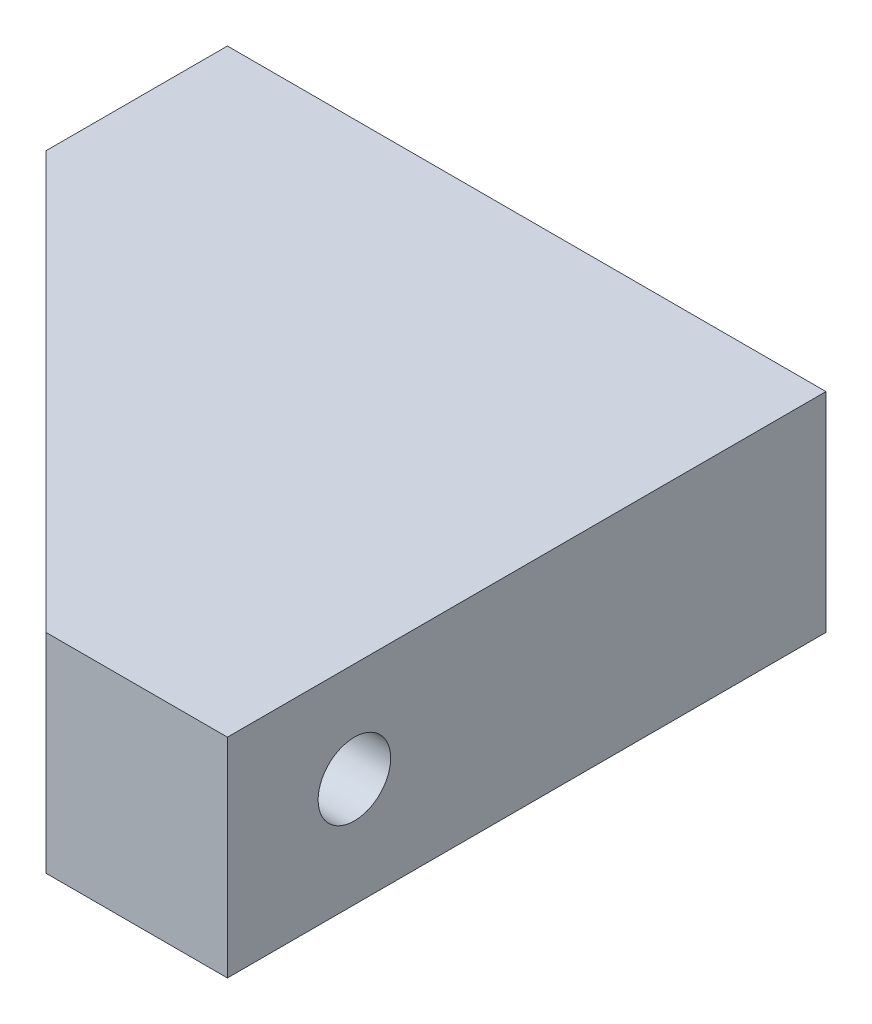
ISO-10303-21;
HEADER;
FILE_DESCRIPTION(('STEP AP214'),'2;1');
FILE_NAME('part.step','',(''),(''),'','','');
FILE_SCHEMA(('AUTOMOTIVE_DESIGN { 1 0 10303 214 1 1 1 1 }'));
ENDSEC;
DATA;
#1=APPLICATION_CONTEXT('core data for automotive mechanical design processes');
#2=APPLICATION_PROTOCOL_DEFINITION('international standard','automotive_design',2000,#1);
#3=PRODUCT_CONTEXT('',#1,'mechanical');
#4=PRODUCT('Part','Part','',(#3));
#5=PRODUCT_RELATED_PRODUCT_CATEGORY('part','',(#4));
#6=PRODUCT_DEFINITION_FORMATION('','',#4);
#7=PRODUCT_DEFINITION_CONTEXT('part definition',#1,'design');
#8=PRODUCT_DEFINITION('design','',#6,#7);
#9=PRODUCT_DEFINITION_SHAPE('','',#8);
#10=(LENGTH_UNIT() NAMED_UNIT(*) SI_UNIT(.MILLI.,.METRE.));
#11=(NAMED_UNIT(*) PLANE_ANGLE_UNIT() SI_UNIT($,.RADIAN.));
#12=(NAMED_UNIT(*) SI_UNIT($,.STERADIAN.) SOLID_ANGLE_UNIT());
#13=UNCERTAINTY_MEASURE_WITH_UNIT(LENGTH_MEASURE(1.E-05),#10,'distance_accuracy_value','');
#14=(GEOMETRIC_REPRESENTATION_CONTEXT(3) GLOBAL_UNCERTAINTY_ASSIGNED_CONTEXT((#13)) GLOBAL_UNIT_ASSIGNED_CONTEXT((#10,
#11,#12)) REPRESENTATION_CONTEXT('',''));
#15=CARTESIAN_POINT('',(0.,0.,0.));
#16=DIRECTION('',(0.,0.,1.));
#17=DIRECTION('',(1.,0.,0.));
#18=AXIS2_PLACEMENT_3D('',#15,#16,#17);
#19=CARTESIAN_POINT('',(-31.9393939393939,9.20833333333334,10.));
#20=DIRECTION('',(1.,0.,0.));
#21=DIRECTION('',(0.,0.,-1.));
#22=AXIS2_PLACEMENT_3D('',#19,#20,#21);
#23=PLANE('',#22);
#24=DIRECTION('',(0.,-1.,0.));
#25=VECTOR('',#24,1.);
#26=CARTESIAN_POINT('',(-31.9393939393939,9.20833333333334,10.));
#27=LINE('',#26,#25);
#28=CARTESIAN_POINT('',(-31.9393939393939,-2.29166666666666,10.));
#29=VERTEX_POINT('',#28);
#30=CARTESIAN_POINT('',(-31.9393939393939,-13.7916666666667,10.));
#31=VERTEX_POINT('',#30);
#32=EDGE_CURVE('E93',#29,#31,#27,.T.);
#33=ORIENTED_EDGE('',*,*,#32,.F.);
#34=DIRECTION('',(0.,0.,1.));
#35=VECTOR('',#34,1.);
#36=CARTESIAN_POINT('',(-31.9393939393939,-2.29166666666666,0.));
#37=LINE('',#36,#35);
#38=CARTESIAN_POINT('',(-31.9393939393939,-2.29166666666666,0.));
#39=VERTEX_POINT('',#38);
#40=EDGE_CURVE('E48',#39,#29,#37,.T.);
#41=ORIENTED_EDGE('',*,*,#40,.F.);
#42=DIRECTION('',(0.,-1.,0.));
#43=VECTOR('',#42,1.);
#44=CARTESIAN_POINT('',(-31.9393939393939,9.20833333333334,0.));
#45=LINE('',#44,#43);
#46=CARTESIAN_POINT('',(-31.9393939393939,-13.7916666666667,0.));
#47=VERTEX_POINT('',#46);
#48=EDGE_CURVE('E92',#39,#47,#45,.T.);
#49=ORIENTED_EDGE('',*,*,#48,.T.);
#50=DIRECTION('',(0.,0.,-1.));
#51=VECTOR('',#50,1.);
#52=CARTESIAN_POINT('',(-31.9393939393939,-13.7916666666667,10.));
#53=LINE('',#52,#51);
#54=EDGE_CURVE('E42',#31,#47,#53,.T.);
#55=ORIENTED_EDGE('',*,*,#54,.F.);
#56=EDGE_LOOP('',(#33,#41,#49,#55));
#57=FACE_BOUND('',#56,.T.);
#58=ADVANCED_FACE('F35',(#57),#23,.F.);
#59=CARTESIAN_POINT('',(-31.9393939393939,-13.7916666666667,10.));
#60=DIRECTION('',(0.,1.,0.));
#61=DIRECTION('',(0.,0.,1.));
#62=AXIS2_PLACEMENT_3D('',#59,#60,#61);
#63=PLANE('',#62);
#64=DIRECTION('',(1.,0.,0.));
#65=VECTOR('',#64,1.);
#66=CARTESIAN_POINT('',(-31.9393939393939,-13.7916666666667,0.));
#67=LINE('',#66,#65);
#68=CARTESIAN_POINT('',(1.06060606060608,-13.7916666666667,0.));
#69=VERTEX_POINT('',#68);
#70=EDGE_CURVE('E56',#47,#69,#67,.T.);
#71=ORIENTED_EDGE('',*,*,#70,.T.);
#72=DIRECTION('',(0.,0.,-1.));
#73=VECTOR('',#72,1.);
#74=CARTESIAN_POINT('',(1.06060606060608,-13.7916666666667,10.));
#75=LINE('',#74,#73);
#76=CARTESIAN_POINT('',(1.06060606060608,-13.7916666666667,33.));
#77=VERTEX_POINT('',#76);
#78=EDGE_CURVE('E106',#77,#69,#75,.T.);
#79=ORIENTED_EDGE('',*,*,#78,.F.);
#80=DIRECTION('',(1.,0.,0.));
#81=VECTOR('',#80,1.);
#82=CARTESIAN_POINT('',(1.06060606060608,-13.7916666666667,33.));
#83=LINE('',#82,#81);
#84=CARTESIAN_POINT('',(-8.93939393939391,-13.7916666666667,33.));
#85=VERTEX_POINT('',#84);
#86=EDGE_CURVE('E96',#85,#77,#83,.T.);
#87=ORIENTED_EDGE('',*,*,#86,.F.);
#88=DIRECTION('',(-0.707106781186548,0.,-0.707106781186547));
#89=VECTOR('',#88,1.);
#90=CARTESIAN_POINT('',(-8.93939393939391,-13.7916666666667,33.));
#91=LINE('',#90,#89);
#92=EDGE_CURVE('E134',#85,#31,#91,.T.);
#93=ORIENTED_EDGE('',*,*,#92,.T.);
#94=ORIENTED_EDGE('',*,*,#54,.T.);
#95=EDGE_LOOP('',(#71,#79,#87,#93,#94));
#96=FACE_BOUND('',#95,.T.);
#97=ADVANCED_FACE('F153',(#96),#63,.F.);
#98=CARTESIAN_POINT('',(1.06060606060608,9.20833333333334,10.));
#99=DIRECTION('',(-1.,0.,0.));
#100=DIRECTION('',(0.,0.,1.));
#101=AXIS2_PLACEMENT_3D('',#98,#99,#100);
#102=PLANE('',#101);
#103=CARTESIAN_POINT('',(1.06060606060608,-7.79166666666666,26.));
#104=DIRECTION('',(-1.,0.,0.));
#105=DIRECTION('',(0.,0.,1.));
#106=AXIS2_PLACEMENT_3D('',#103,#104,#105);
#107=CIRCLE('',#106,2.);
#108=CARTESIAN_POINT('',(1.06060606060608,-7.79166666666666,28.));
#109=VERTEX_POINT('',#108);
#110=EDGE_CURVE('E113',#109,#109,#107,.T.);
#111=ORIENTED_EDGE('',*,*,#110,.T.);
#112=EDGE_LOOP('',(#111));
#113=FACE_BOUND('',#112,.T.);
#114=DIRECTION('',(0.,1.,0.));
#115=VECTOR('',#114,1.);
#116=CARTESIAN_POINT('',(1.06060606060608,9.20833333333334,0.));
#117=LINE('',#116,#115);
#118=CARTESIAN_POINT('',(1.06060606060608,-2.29166666666666,0.));
#119=VERTEX_POINT('',#118);
#120=EDGE_CURVE('E98',#69,#119,#117,.T.);
#121=ORIENTED_EDGE('',*,*,#120,.T.);
#122=DIRECTION('',(0.,0.,1.));
#123=VECTOR('',#122,1.);
#124=CARTESIAN_POINT('',(1.06060606060608,-2.29166666666666,10.));
#125=LINE('',#124,#123);
#126=CARTESIAN_POINT('',(1.06060606060608,-2.29166666666666,33.));
#127=VERTEX_POINT('',#126);
#128=EDGE_CURVE('E82',#119,#127,#125,.T.);
#129=ORIENTED_EDGE('',*,*,#128,.T.);
#130=DIRECTION('',(0.,1.,0.));
#131=VECTOR('',#130,1.);
#132=CARTESIAN_POINT('',(1.06060606060608,9.20833333333334,33.));
#133=LINE('',#132,#131);
#134=EDGE_CURVE('E112',#77,#127,#133,.T.);
#135=ORIENTED_EDGE('',*,*,#134,.F.);
#136=ORIENTED_EDGE('',*,*,#78,.T.);
#137=EDGE_LOOP('',(#121,#129,#135,#136));
#138=FACE_BOUND('',#137,.T.);
#139=ADVANCED_FACE('F155',(#113,#138),#102,.F.);
#140=CARTESIAN_POINT('',(0.,0.,0.));
#141=DIRECTION('',(0.,0.,1.));
#142=DIRECTION('',(1.,0.,0.));
#143=AXIS2_PLACEMENT_3D('',#140,#141,#142);
#144=PLANE('',#143);
#145=CARTESIAN_POINT('',(-24.9393939393939,-7.79166666666666,0.));
#146=DIRECTION('',(0.,0.,1.));
#147=DIRECTION('',(1.,0.,0.));
#148=AXIS2_PLACEMENT_3D('',#145,#146,#147);
#149=CIRCLE('',#148,2.);
#150=CARTESIAN_POINT('',(-22.9393939393939,-7.79166666666666,0.));
#151=VERTEX_POINT('',#150);
#152=EDGE_CURVE('E109',#151,#151,#149,.T.);
#153=ORIENTED_EDGE('',*,*,#152,.T.);
#154=EDGE_LOOP('',(#153));
#155=FACE_BOUND('',#154,.T.);
#156=ORIENTED_EDGE('',*,*,#48,.F.);
#157=DIRECTION('',(-1.,0.,0.));
#158=VECTOR('',#157,1.);
#159=CARTESIAN_POINT('',(21.0606060606061,-2.29166666666666,0.));
#160=LINE('',#159,#158);
#161=EDGE_CURVE('E79',#119,#39,#160,.T.);
#162=ORIENTED_EDGE('',*,*,#161,.F.);
#163=ORIENTED_EDGE('',*,*,#120,.F.);
#164=ORIENTED_EDGE('',*,*,#70,.F.);
#165=EDGE_LOOP('',(#156,#162,#163,#164));
#166=FACE_BOUND('',#165,.T.);
#167=ADVANCED_FACE('F95',(#155,#166),#144,.F.);
#168=CARTESIAN_POINT('',(0.,0.,33.));
#169=DIRECTION('',(0.,0.,-1.));
#170=DIRECTION('',(-1.,0.,0.));
#171=AXIS2_PLACEMENT_3D('',#168,#169,#170);
#172=PLANE('',#171);
#173=ORIENTED_EDGE('',*,*,#134,.T.);
#174=DIRECTION('',(-1.,0.,0.));
#175=VECTOR('',#174,1.);
#176=CARTESIAN_POINT('',(21.0606060606061,-2.29166666666666,33.));
#177=LINE('',#176,#175);
#178=CARTESIAN_POINT('',(-8.93939393939392,-2.29166666666666,33.));
#179=VERTEX_POINT('',#178);
#180=EDGE_CURVE('E87',#127,#179,#177,.T.);
#181=ORIENTED_EDGE('',*,*,#180,.T.);
#182=DIRECTION('',(0.,-1.,0.));
#183=VECTOR('',#182,1.);
#184=CARTESIAN_POINT('',(-8.93939393939392,9.20833333333334,33.));
#185=LINE('',#184,#183);
#186=EDGE_CURVE('E101',#179,#85,#185,.T.);
#187=ORIENTED_EDGE('',*,*,#186,.T.);
#188=ORIENTED_EDGE('',*,*,#86,.T.);
#189=EDGE_LOOP('',(#173,#181,#187,#188));
#190=FACE_BOUND('',#189,.T.);
#191=ADVANCED_FACE('F147',(#190),#172,.F.);
#192=CARTESIAN_POINT('',(-24.9393939393939,-7.79166666666666,-23.));
#193=DIRECTION('',(0.,0.,1.));
#194=DIRECTION('',(1.,0.,0.));
#195=AXIS2_PLACEMENT_3D('',#192,#193,#194);
#196=CYLINDRICAL_SURFACE('',#195,2.);
#197=CARTESIAN_POINT('',(-24.9393939393939,-7.79166666666666,10.));
#198=DIRECTION('',(0.,0.,-1.));
#199=DIRECTION('',(-1.,0.,0.));
#200=AXIS2_PLACEMENT_3D('',#197,#198,#199);
#201=CIRCLE('',#200,2.);
#202=CARTESIAN_POINT('',(-26.9393939393939,-7.79166666666666,10.));
#203=VERTEX_POINT('',#202);
#204=EDGE_CURVE('E120',#203,#203,#201,.F.);
#205=ORIENTED_EDGE('',*,*,#204,.T.);
#206=EDGE_LOOP('',(#205));
#207=FACE_BOUND('',#206,.T.);
#208=ORIENTED_EDGE('',*,*,#152,.F.);
#209=EDGE_LOOP('',(#208));
#210=FACE_BOUND('',#209,.T.);
#211=ADVANCED_FACE('F226',(#207,#210),#196,.F.);
#212=CARTESIAN_POINT('',(24.0606060606061,-7.79166666666666,26.));
#213=DIRECTION('',(-1.,0.,0.));
#214=DIRECTION('',(0.,-1.,0.));
#215=AXIS2_PLACEMENT_3D('',#212,#213,#214);
#216=CYLINDRICAL_SURFACE('',#215,2.);
#217=CARTESIAN_POINT('',(-8.93939393939391,-7.79166666666666,26.));
#218=DIRECTION('',(1.,0.,0.));
#219=DIRECTION('',(0.,0.,-1.));
#220=AXIS2_PLACEMENT_3D('',#217,#218,#219);
#221=CIRCLE('',#220,2.);
#222=CARTESIAN_POINT('',(-8.93939393939391,-7.79166666666666,24.));
#223=VERTEX_POINT('',#222);
#224=EDGE_CURVE('E116',#223,#223,#221,.F.);
#225=ORIENTED_EDGE('',*,*,#224,.T.);
#226=EDGE_LOOP('',(#225));
#227=FACE_BOUND('',#226,.T.);
#228=ORIENTED_EDGE('',*,*,#110,.F.);
#229=EDGE_LOOP('',(#228));
#230=FACE_BOUND('',#229,.T.);
#231=ADVANCED_FACE('F222',(#227,#230),#216,.F.);
#232=CARTESIAN_POINT('',(-8.93939393939391,9.20833333333334,33.));
#233=DIRECTION('',(-0.707106781186547,0.,0.707106781186548));
#234=DIRECTION('',(0.707106781186548,0.,0.707106781186547));
#235=AXIS2_PLACEMENT_3D('',#232,#233,#234);
#236=PLANE('',#235);
#237=DIRECTION('',(0.707106781186548,0.,0.707106781186547));
#238=VECTOR('',#237,1.);
#239=CARTESIAN_POINT('',(-8.93939393939391,-2.29166666666666,33.));
#240=LINE('',#239,#238);
#241=EDGE_CURVE('E11',#29,#179,#240,.T.);
#242=ORIENTED_EDGE('',*,*,#241,.F.);
#243=ORIENTED_EDGE('',*,*,#32,.T.);
#244=ORIENTED_EDGE('',*,*,#92,.F.);
#245=ORIENTED_EDGE('',*,*,#186,.F.);
#246=EDGE_LOOP('',(#242,#243,#244,#245));
#247=FACE_BOUND('',#246,.T.);
#248=CARTESIAN_POINT('',(-24.9393939393939,-7.79166666666666,17.));
#249=DIRECTION('',(-0.707106781186547,0.,0.707106781186548));
#250=DIRECTION('',(-0.707106781186548,0.,-0.707106781186547));
#251=AXIS2_PLACEMENT_3D('',#248,#249,#250);
#252=ELLIPSE('',#251,4.94974746830583,3.5);
#253=CARTESIAN_POINT('',(-28.4393939393939,-7.79166666666666,13.5));
#254=VERTEX_POINT('',#253);
#255=EDGE_CURVE('E118',#254,#254,#252,.T.);
#256=ORIENTED_EDGE('',*,*,#255,.F.);
#257=EDGE_LOOP('',(#256));
#258=FACE_BOUND('',#257,.T.);
#259=CARTESIAN_POINT('',(-15.9393939393939,-7.79166666666666,26.));
#260=DIRECTION('',(-0.707106781186547,0.,0.707106781186548));
#261=DIRECTION('',(0.707106781186548,0.,0.707106781186547));
#262=AXIS2_PLACEMENT_3D('',#259,#260,#261);
#263=ELLIPSE('',#262,4.94974746830583,3.5);
#264=CARTESIAN_POINT('',(-12.4393939393939,-7.79166666666666,29.5));
#265=VERTEX_POINT('',#264);
#266=EDGE_CURVE('E114',#265,#265,#263,.T.);
#267=ORIENTED_EDGE('',*,*,#266,.F.);
#268=EDGE_LOOP('',(#267));
#269=FACE_BOUND('',#268,.T.);
#270=ADVANCED_FACE('F151',(#247,#258,#269),#236,.T.);
#271=CARTESIAN_POINT('',(-8.93939393939391,-7.79166666666666,26.));
#272=DIRECTION('',(1.,0.,0.));
#273=DIRECTION('',(0.,0.,-1.));
#274=AXIS2_PLACEMENT_3D('',#271,#272,#273);
#275=PLANE('',#274);
#276=CARTESIAN_POINT('',(-8.93939393939391,-7.79166666666666,26.));
#277=DIRECTION('',(1.,0.,0.));
#278=DIRECTION('',(0.,0.,-1.));
#279=AXIS2_PLACEMENT_3D('',#276,#277,#278);
#280=CIRCLE('',#279,3.5);
#281=CARTESIAN_POINT('',(-8.93939393939391,-7.79166666666666,22.5));
#282=VERTEX_POINT('',#281);
#283=EDGE_CURVE('E117',#282,#282,#280,.T.);
#284=ORIENTED_EDGE('',*,*,#283,.F.);
#285=EDGE_LOOP('',(#284));
#286=FACE_BOUND('',#285,.T.);
#287=ORIENTED_EDGE('',*,*,#224,.F.);
#288=EDGE_LOOP('',(#287));
#289=FACE_BOUND('',#288,.T.);
#290=ADVANCED_FACE('F197',(#286,#289),#275,.F.);
#291=CARTESIAN_POINT('',(-41.9393939393939,-7.79166666666666,26.));
#292=DIRECTION('',(1.,0.,0.));
#293=DIRECTION('',(0.,0.,-1.));
#294=AXIS2_PLACEMENT_3D('',#291,#292,#293);
#295=CYLINDRICAL_SURFACE('',#294,3.5);
#296=ORIENTED_EDGE('',*,*,#266,.T.);
#297=EDGE_LOOP('',(#296));
#298=FACE_BOUND('',#297,.T.);
#299=ORIENTED_EDGE('',*,*,#283,.T.);
#300=EDGE_LOOP('',(#299));
#301=FACE_BOUND('',#300,.T.);
#302=ADVANCED_FACE('F187',(#298,#301),#295,.F.);
#303=CARTESIAN_POINT('',(-24.9393939393939,-7.79166666666666,10.));
#304=DIRECTION('',(0.,0.,-1.));
#305=DIRECTION('',(-1.,0.,0.));
#306=AXIS2_PLACEMENT_3D('',#303,#304,#305);
#307=PLANE('',#306);
#308=CARTESIAN_POINT('',(-24.9393939393939,-7.79166666666666,10.));
#309=DIRECTION('',(0.,0.,-1.));
#310=DIRECTION('',(-1.,0.,0.));
#311=AXIS2_PLACEMENT_3D('',#308,#309,#310);
#312=CIRCLE('',#311,3.5);
#313=CARTESIAN_POINT('',(-28.4393939393939,-7.79166666666666,10.));
#314=VERTEX_POINT('',#313);
#315=EDGE_CURVE('E121',#314,#314,#312,.T.);
#316=ORIENTED_EDGE('',*,*,#315,.F.);
#317=EDGE_LOOP('',(#316));
#318=FACE_BOUND('',#317,.T.);
#319=ORIENTED_EDGE('',*,*,#204,.F.);
#320=EDGE_LOOP('',(#319));
#321=FACE_BOUND('',#320,.T.);
#322=ADVANCED_FACE('F176',(#318,#321),#307,.F.);
#323=CARTESIAN_POINT('',(-24.9393939393939,-7.79166666666666,43.));
#324=DIRECTION('',(0.,0.,-1.));
#325=DIRECTION('',(-1.,0.,0.));
#326=AXIS2_PLACEMENT_3D('',#323,#324,#325);
#327=CYLINDRICAL_SURFACE('',#326,3.5);
#328=ORIENTED_EDGE('',*,*,#255,.T.);
#329=EDGE_LOOP('',(#328));
#330=FACE_BOUND('',#329,.T.);
#331=ORIENTED_EDGE('',*,*,#315,.T.);
#332=EDGE_LOOP('',(#331));
#333=FACE_BOUND('',#332,.T.);
#334=ADVANCED_FACE('F171',(#330,#333),#327,.F.);
#335=CARTESIAN_POINT('',(21.0606060606061,-2.29166666666666,0.));
#336=DIRECTION('',(0.,-1.,0.));
#337=DIRECTION('',(0.,0.,-1.));
#338=AXIS2_PLACEMENT_3D('',#335,#336,#337);
#339=PLANE('',#338);
#340=ORIENTED_EDGE('',*,*,#161,.T.);
#341=ORIENTED_EDGE('',*,*,#40,.T.);
#342=ORIENTED_EDGE('',*,*,#241,.T.);
#343=ORIENTED_EDGE('',*,*,#180,.F.);
#344=ORIENTED_EDGE('',*,*,#128,.F.);
#345=EDGE_LOOP('',(#340,#341,#342,#343,#344));
#346=FACE_BOUND('',#345,.T.);
#347=ADVANCED_FACE('F80',(#346),#339,.F.);
#348=CLOSED_SHELL('',(#58,#97,#139,#167,#191,#211,#231,#270,#290,#302,#322,#334,#347));
#349=MANIFOLD_SOLID_BREP('B2',#348);
#350=ADVANCED_BREP_SHAPE_REPRESENTATION('',(#18,#349),#14);
#351=SHAPE_DEFINITION_REPRESENTATION(#9,#350);
ENDSEC;
END-ISO-10303-21;
